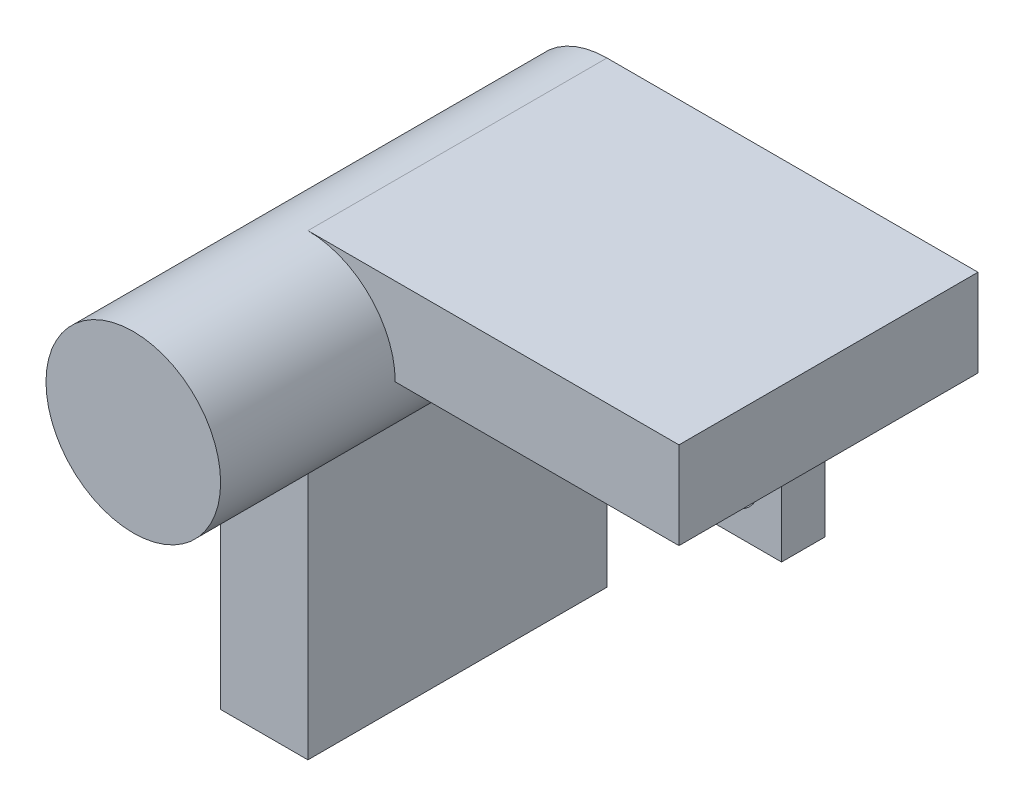
ISO-10303-21;
HEADER;
FILE_DESCRIPTION(('STEP AP214'),'2;1');
FILE_NAME('part.step','',(''),(''),'','','');
FILE_SCHEMA(('AUTOMOTIVE_DESIGN { 1 0 10303 214 1 1 1 1 }'));
ENDSEC;
DATA;
#1=APPLICATION_CONTEXT('core data for automotive mechanical design processes');
#2=APPLICATION_PROTOCOL_DEFINITION('international standard','automotive_design',2000,#1);
#3=PRODUCT_CONTEXT('',#1,'mechanical');
#4=PRODUCT('Part','Part','',(#3));
#5=PRODUCT_RELATED_PRODUCT_CATEGORY('part','',(#4));
#6=PRODUCT_DEFINITION_FORMATION('','',#4);
#7=PRODUCT_DEFINITION_CONTEXT('part definition',#1,'design');
#8=PRODUCT_DEFINITION('design','',#6,#7);
#9=PRODUCT_DEFINITION_SHAPE('','',#8);
#10=(LENGTH_UNIT() NAMED_UNIT(*) SI_UNIT(.MILLI.,.METRE.));
#11=(NAMED_UNIT(*) PLANE_ANGLE_UNIT() SI_UNIT($,.RADIAN.));
#12=(NAMED_UNIT(*) SI_UNIT($,.STERADIAN.) SOLID_ANGLE_UNIT());
#13=UNCERTAINTY_MEASURE_WITH_UNIT(LENGTH_MEASURE(1.E-05),#10,'distance_accuracy_value','');
#14=(GEOMETRIC_REPRESENTATION_CONTEXT(3) GLOBAL_UNCERTAINTY_ASSIGNED_CONTEXT((#13)) GLOBAL_UNIT_ASSIGNED_CONTEXT((#10,
#11,#12)) REPRESENTATION_CONTEXT('',''));
#15=CARTESIAN_POINT('',(0.,0.,0.));
#16=DIRECTION('',(0.,0.,1.));
#17=DIRECTION('',(1.,0.,0.));
#18=AXIS2_PLACEMENT_3D('',#15,#16,#17);
#19=CARTESIAN_POINT('',(0.,0.,0.));
#20=DIRECTION('',(0.,0.,1.));
#21=DIRECTION('',(1.,0.,0.));
#22=AXIS2_PLACEMENT_3D('',#19,#20,#21);
#23=PLANE('',#22);
#24=CARTESIAN_POINT('',(-46.,-4.,0.));
#25=DIRECTION('',(0.,0.,1.));
#26=DIRECTION('',(1.,0.,0.));
#27=AXIS2_PLACEMENT_3D('',#24,#25,#26);
#28=CIRCLE('',#27,4.00000000000001);
#29=CARTESIAN_POINT('',(-42.,-4.,0.));
#30=VERTEX_POINT('',#29);
#31=CARTESIAN_POINT('',(-46.,0.,0.));
#32=VERTEX_POINT('',#31);
#33=EDGE_CURVE('E50',#30,#32,#28,.T.);
#34=ORIENTED_EDGE('',*,*,#33,.F.);
#35=DIRECTION('',(-1.,0.,0.));
#36=VECTOR('',#35,1.);
#37=CARTESIAN_POINT('',(0.,-4.,0.));
#38=LINE('',#37,#36);
#39=CARTESIAN_POINT('',(-29.,-4.,0.));
#40=VERTEX_POINT('',#39);
#41=EDGE_CURVE('E141',#40,#30,#38,.T.);
#42=ORIENTED_EDGE('',*,*,#41,.F.);
#43=DIRECTION('',(0.,1.,0.));
#44=VECTOR('',#43,1.);
#45=CARTESIAN_POINT('',(-29.,0.,0.));
#46=LINE('',#45,#44);
#47=CARTESIAN_POINT('',(-29.,0.,0.));
#48=VERTEX_POINT('',#47);
#49=EDGE_CURVE('E137',#40,#48,#46,.T.);
#50=ORIENTED_EDGE('',*,*,#49,.T.);
#51=DIRECTION('',(-1.,0.,0.));
#52=VECTOR('',#51,1.);
#53=CARTESIAN_POINT('',(0.,0.,0.));
#54=LINE('',#53,#52);
#55=EDGE_CURVE('E188',#48,#32,#54,.T.);
#56=ORIENTED_EDGE('',*,*,#55,.T.);
#57=EDGE_LOOP('',(#34,#42,#50,#56));
#58=FACE_BOUND('',#57,.T.);
#59=ADVANCED_FACE('F39',(#58),#23,.T.);
#60=CARTESIAN_POINT('',(-50.,-4.,0.));
#61=VERTEX_POINT('',#60);
#62=CARTESIAN_POINT('',(-46.,-8.00000000000001,0.));
#63=VERTEX_POINT('',#62);
#64=EDGE_CURVE('E11',#61,#63,#28,.T.);
#65=ORIENTED_EDGE('',*,*,#64,.F.);
#66=DIRECTION('',(0.,1.,0.));
#67=VECTOR('',#66,1.);
#68=CARTESIAN_POINT('',(-50.,0.,0.));
#69=LINE('',#68,#67);
#70=CARTESIAN_POINT('',(-50.,-21.,0.));
#71=VERTEX_POINT('',#70);
#72=EDGE_CURVE('E194',#71,#61,#69,.T.);
#73=ORIENTED_EDGE('',*,*,#72,.F.);
#74=DIRECTION('',(-1.,0.,0.));
#75=VECTOR('',#74,1.);
#76=CARTESIAN_POINT('',(0.,-21.,0.));
#77=LINE('',#76,#75);
#78=CARTESIAN_POINT('',(-46.,-21.,0.));
#79=VERTEX_POINT('',#78);
#80=EDGE_CURVE('E189',#79,#71,#77,.T.);
#81=ORIENTED_EDGE('',*,*,#80,.F.);
#82=DIRECTION('',(0.,1.,0.));
#83=VECTOR('',#82,1.);
#84=CARTESIAN_POINT('',(-46.,0.,0.));
#85=LINE('',#84,#83);
#86=EDGE_CURVE('E183',#79,#63,#85,.T.);
#87=ORIENTED_EDGE('',*,*,#86,.T.);
#88=EDGE_LOOP('',(#65,#73,#81,#87));
#89=FACE_BOUND('',#88,.T.);
#90=ADVANCED_FACE('F222',(#89),#23,.T.);
#91=CARTESIAN_POINT('',(-46.,-4.,-41.398484809835));
#92=DIRECTION('',(0.,0.,1.));
#93=DIRECTION('',(1.,0.,0.));
#94=AXIS2_PLACEMENT_3D('',#91,#92,#93);
#95=CYLINDRICAL_SURFACE('',#94,4.00000000000001);
#96=DIRECTION('',(0.,0.,1.));
#97=VECTOR('',#96,1.);
#98=CARTESIAN_POINT('',(-46.,0.,-41.398484809835));
#99=LINE('',#98,#97);
#100=CARTESIAN_POINT('',(-46.,0.,-13.7));
#101=VERTEX_POINT('',#100);
#102=EDGE_CURVE('E43',#101,#32,#99,.T.);
#103=ORIENTED_EDGE('',*,*,#102,.F.);
#104=CARTESIAN_POINT('',(-46.,-4.,-13.7));
#105=DIRECTION('',(0.,0.,-1.));
#106=DIRECTION('',(0.,1.,0.));
#107=AXIS2_PLACEMENT_3D('',#104,#105,#106);
#108=CIRCLE('',#107,4.00000000000001);
#109=CARTESIAN_POINT('',(-50.,-4.,-13.7));
#110=VERTEX_POINT('',#109);
#111=EDGE_CURVE('E163',#110,#101,#108,.T.);
#112=ORIENTED_EDGE('',*,*,#111,.F.);
#113=DIRECTION('',(0.,0.,1.));
#114=VECTOR('',#113,1.);
#115=CARTESIAN_POINT('',(-50.,-4.,-41.398484809835));
#116=LINE('',#115,#114);
#117=EDGE_CURVE('E182',#110,#61,#116,.T.);
#118=ORIENTED_EDGE('',*,*,#117,.T.);
#119=ORIENTED_EDGE('',*,*,#64,.T.);
#120=DIRECTION('',(0.,0.,1.));
#121=VECTOR('',#120,1.);
#122=CARTESIAN_POINT('',(-46.,-8.00000000000001,-41.398484809835));
#123=LINE('',#122,#121);
#124=CARTESIAN_POINT('',(-46.,-8.00000000000001,-11.7));
#125=VERTEX_POINT('',#124);
#126=EDGE_CURVE('E203',#125,#63,#123,.T.);
#127=ORIENTED_EDGE('',*,*,#126,.F.);
#128=CARTESIAN_POINT('',(-46.,-4.,-11.7));
#129=DIRECTION('',(0.,0.,-1.));
#130=DIRECTION('',(0.,1.,0.));
#131=AXIS2_PLACEMENT_3D('',#128,#129,#130);
#132=CIRCLE('',#131,4.00000000000001);
#133=CARTESIAN_POINT('',(-42.,-4.,-11.7));
#134=VERTEX_POINT('',#133);
#135=EDGE_CURVE('E200',#125,#134,#132,.F.);
#136=ORIENTED_EDGE('',*,*,#135,.T.);
#137=DIRECTION('',(0.,0.,1.));
#138=VECTOR('',#137,1.);
#139=CARTESIAN_POINT('',(-42.,-4.,-41.398484809835));
#140=LINE('',#139,#138);
#141=EDGE_CURVE('E142',#134,#30,#140,.T.);
#142=ORIENTED_EDGE('',*,*,#141,.T.);
#143=ORIENTED_EDGE('',*,*,#33,.T.);
#144=EDGE_LOOP('',(#103,#112,#118,#119,#127,#136,#142,#143));
#145=FACE_BOUND('',#144,.T.);
#146=CARTESIAN_POINT('',(-46.,-4.,8.));
#147=DIRECTION('',(0.,0.,1.));
#148=DIRECTION('',(1.,0.,0.));
#149=AXIS2_PLACEMENT_3D('',#146,#147,#148);
#150=CIRCLE('',#149,4.00000000000001);
#151=CARTESIAN_POINT('',(-42.,-4.,8.));
#152=VERTEX_POINT('',#151);
#153=EDGE_CURVE('E176',#152,#152,#150,.T.);
#154=ORIENTED_EDGE('',*,*,#153,.F.);
#155=EDGE_LOOP('',(#154));
#156=FACE_BOUND('',#155,.T.);
#157=ADVANCED_FACE('F41',(#145,#156),#95,.T.);
#158=CARTESIAN_POINT('',(-50.,0.,-41.398484809835));
#159=DIRECTION('',(1.,0.,0.));
#160=DIRECTION('',(0.,0.,-1.));
#161=AXIS2_PLACEMENT_3D('',#158,#159,#160);
#162=PLANE('',#161);
#163=ORIENTED_EDGE('',*,*,#117,.F.);
#164=DIRECTION('',(0.,-1.,0.));
#165=VECTOR('',#164,1.);
#166=CARTESIAN_POINT('',(-50.,0.,-13.7));
#167=LINE('',#166,#165);
#168=CARTESIAN_POINT('',(-50.,-21.,-13.7));
#169=VERTEX_POINT('',#168);
#170=EDGE_CURVE('E160',#110,#169,#167,.T.);
#171=ORIENTED_EDGE('',*,*,#170,.T.);
#172=DIRECTION('',(0.,0.,1.));
#173=VECTOR('',#172,1.);
#174=CARTESIAN_POINT('',(-50.,-21.,-41.398484809835));
#175=LINE('',#174,#173);
#176=EDGE_CURVE('E197',#169,#71,#175,.T.);
#177=ORIENTED_EDGE('',*,*,#176,.T.);
#178=ORIENTED_EDGE('',*,*,#72,.T.);
#179=EDGE_LOOP('',(#163,#171,#177,#178));
#180=FACE_BOUND('',#179,.T.);
#181=ADVANCED_FACE('F218',(#180),#162,.F.);
#182=CARTESIAN_POINT('',(0.,-21.,-41.398484809835));
#183=DIRECTION('',(0.,1.,0.));
#184=DIRECTION('',(-1.,0.,0.));
#185=AXIS2_PLACEMENT_3D('',#182,#183,#184);
#186=PLANE('',#185);
#187=ORIENTED_EDGE('',*,*,#176,.F.);
#188=DIRECTION('',(1.,0.,0.));
#189=VECTOR('',#188,1.);
#190=CARTESIAN_POINT('',(0.,-21.,-13.7));
#191=LINE('',#190,#189);
#192=CARTESIAN_POINT('',(-46.,-21.,-13.7));
#193=VERTEX_POINT('',#192);
#194=EDGE_CURVE('E157',#169,#193,#191,.T.);
#195=ORIENTED_EDGE('',*,*,#194,.T.);
#196=DIRECTION('',(0.,0.,1.));
#197=VECTOR('',#196,1.);
#198=CARTESIAN_POINT('',(-46.,-21.,-41.398484809835));
#199=LINE('',#198,#197);
#200=EDGE_CURVE('E193',#193,#79,#199,.T.);
#201=ORIENTED_EDGE('',*,*,#200,.T.);
#202=ORIENTED_EDGE('',*,*,#80,.T.);
#203=EDGE_LOOP('',(#187,#195,#201,#202));
#204=FACE_BOUND('',#203,.T.);
#205=ADVANCED_FACE('F239',(#204),#186,.F.);
#206=CARTESIAN_POINT('',(-46.,0.,-41.398484809835));
#207=DIRECTION('',(1.,0.,0.));
#208=DIRECTION('',(0.,0.,-1.));
#209=AXIS2_PLACEMENT_3D('',#206,#207,#208);
#210=PLANE('',#209);
#211=ORIENTED_EDGE('',*,*,#200,.F.);
#212=DIRECTION('',(0.,-1.,0.));
#213=VECTOR('',#212,1.);
#214=CARTESIAN_POINT('',(-46.,0.,-13.7));
#215=LINE('',#214,#213);
#216=CARTESIAN_POINT('',(-46.,-14.,-13.7));
#217=VERTEX_POINT('',#216);
#218=EDGE_CURVE('E155',#217,#193,#215,.T.);
#219=ORIENTED_EDGE('',*,*,#218,.F.);
#220=DIRECTION('',(0.,0.,1.));
#221=VECTOR('',#220,1.);
#222=CARTESIAN_POINT('',(-46.,-14.,-13.7));
#223=LINE('',#222,#221);
#224=CARTESIAN_POINT('',(-46.,-14.,-11.7));
#225=VERTEX_POINT('',#224);
#226=EDGE_CURVE('E166',#217,#225,#223,.T.);
#227=ORIENTED_EDGE('',*,*,#226,.T.);
#228=DIRECTION('',(0.,1.,0.));
#229=VECTOR('',#228,1.);
#230=CARTESIAN_POINT('',(-46.,0.,-11.7));
#231=LINE('',#230,#229);
#232=EDGE_CURVE('E192',#225,#125,#231,.T.);
#233=ORIENTED_EDGE('',*,*,#232,.T.);
#234=ORIENTED_EDGE('',*,*,#126,.T.);
#235=ORIENTED_EDGE('',*,*,#86,.F.);
#236=EDGE_LOOP('',(#211,#219,#227,#233,#234,#235));
#237=FACE_BOUND('',#236,.T.);
#238=ADVANCED_FACE('F226',(#237),#210,.T.);
#239=CARTESIAN_POINT('',(0.,-4.,-41.398484809835));
#240=DIRECTION('',(0.,1.,0.));
#241=DIRECTION('',(0.,0.,1.));
#242=AXIS2_PLACEMENT_3D('',#239,#240,#241);
#243=PLANE('',#242);
#244=DIRECTION('',(-1.,0.,0.));
#245=VECTOR('',#244,1.);
#246=CARTESIAN_POINT('',(0.,-4.,-11.7));
#247=LINE('',#246,#245);
#248=CARTESIAN_POINT('',(-36.,-4.,-11.7));
#249=VERTEX_POINT('',#248);
#250=EDGE_CURVE('E178',#249,#134,#247,.T.);
#251=ORIENTED_EDGE('',*,*,#250,.F.);
#252=DIRECTION('',(0.,0.,1.));
#253=VECTOR('',#252,1.);
#254=CARTESIAN_POINT('',(-36.,-4.,-13.7));
#255=LINE('',#254,#253);
#256=CARTESIAN_POINT('',(-36.,-4.,-13.7));
#257=VERTEX_POINT('',#256);
#258=EDGE_CURVE('E147',#257,#249,#255,.T.);
#259=ORIENTED_EDGE('',*,*,#258,.F.);
#260=DIRECTION('',(1.,0.,0.));
#261=VECTOR('',#260,1.);
#262=CARTESIAN_POINT('',(0.,-4.,-13.7));
#263=LINE('',#262,#261);
#264=CARTESIAN_POINT('',(-29.,-4.,-13.7));
#265=VERTEX_POINT('',#264);
#266=EDGE_CURVE('E125',#257,#265,#263,.T.);
#267=ORIENTED_EDGE('',*,*,#266,.T.);
#268=DIRECTION('',(0.,0.,1.));
#269=VECTOR('',#268,1.);
#270=CARTESIAN_POINT('',(-29.,-4.,-41.398484809835));
#271=LINE('',#270,#269);
#272=EDGE_CURVE('E134',#265,#40,#271,.T.);
#273=ORIENTED_EDGE('',*,*,#272,.T.);
#274=ORIENTED_EDGE('',*,*,#41,.T.);
#275=ORIENTED_EDGE('',*,*,#141,.F.);
#276=EDGE_LOOP('',(#251,#259,#267,#273,#274,#275));
#277=FACE_BOUND('',#276,.T.);
#278=ADVANCED_FACE('F145',(#277),#243,.F.);
#279=CARTESIAN_POINT('',(-29.,0.,-41.398484809835));
#280=DIRECTION('',(1.,0.,0.));
#281=DIRECTION('',(0.,0.,-1.));
#282=AXIS2_PLACEMENT_3D('',#279,#280,#281);
#283=PLANE('',#282);
#284=ORIENTED_EDGE('',*,*,#272,.F.);
#285=DIRECTION('',(0.,-1.,0.));
#286=VECTOR('',#285,1.);
#287=CARTESIAN_POINT('',(-29.,0.,-13.7));
#288=LINE('',#287,#286);
#289=CARTESIAN_POINT('',(-29.,0.,-13.7));
#290=VERTEX_POINT('',#289);
#291=EDGE_CURVE('E119',#290,#265,#288,.T.);
#292=ORIENTED_EDGE('',*,*,#291,.F.);
#293=DIRECTION('',(0.,0.,1.));
#294=VECTOR('',#293,1.);
#295=CARTESIAN_POINT('',(-29.,0.,-41.398484809835));
#296=LINE('',#295,#294);
#297=EDGE_CURVE('E185',#290,#48,#296,.T.);
#298=ORIENTED_EDGE('',*,*,#297,.T.);
#299=ORIENTED_EDGE('',*,*,#49,.F.);
#300=EDGE_LOOP('',(#284,#292,#298,#299));
#301=FACE_BOUND('',#300,.T.);
#302=ADVANCED_FACE('F135',(#301),#283,.T.);
#303=CARTESIAN_POINT('',(0.,0.,-41.398484809835));
#304=DIRECTION('',(0.,1.,0.));
#305=DIRECTION('',(-1.,0.,0.));
#306=AXIS2_PLACEMENT_3D('',#303,#304,#305);
#307=PLANE('',#306);
#308=ORIENTED_EDGE('',*,*,#297,.F.);
#309=DIRECTION('',(1.,0.,0.));
#310=VECTOR('',#309,1.);
#311=CARTESIAN_POINT('',(0.,0.,-13.7));
#312=LINE('',#311,#310);
#313=EDGE_CURVE('E128',#101,#290,#312,.T.);
#314=ORIENTED_EDGE('',*,*,#313,.F.);
#315=ORIENTED_EDGE('',*,*,#102,.T.);
#316=ORIENTED_EDGE('',*,*,#55,.F.);
#317=EDGE_LOOP('',(#308,#314,#315,#316));
#318=FACE_BOUND('',#317,.T.);
#319=ADVANCED_FACE('F237',(#318),#307,.T.);
#320=CARTESIAN_POINT('',(0.,0.,8.));
#321=DIRECTION('',(0.,0.,1.));
#322=DIRECTION('',(1.,0.,0.));
#323=AXIS2_PLACEMENT_3D('',#320,#321,#322);
#324=PLANE('',#323);
#325=ORIENTED_EDGE('',*,*,#153,.T.);
#326=EDGE_LOOP('',(#325));
#327=FACE_BOUND('',#326,.T.);
#328=ADVANCED_FACE('F254',(#327),#324,.T.);
#329=CARTESIAN_POINT('',(-46.,-4.,-11.7));
#330=DIRECTION('',(0.,0.,-1.));
#331=DIRECTION('',(0.,1.,0.));
#332=AXIS2_PLACEMENT_3D('',#329,#330,#331);
#333=PLANE('',#332);
#334=CARTESIAN_POINT('',(-38.5251262658471,-11.4748737341529,-11.7));
#335=DIRECTION('',(0.,0.,-1.));
#336=DIRECTION('',(0.,1.,0.));
#337=AXIS2_PLACEMENT_3D('',#334,#335,#336);
#338=CIRCLE('',#337,1.5);
#339=CARTESIAN_POINT('',(-37.0251262658471,-11.4748737341529,-11.7));
#340=VERTEX_POINT('',#339);
#341=EDGE_CURVE('E449',#340,#340,#338,.T.);
#342=ORIENTED_EDGE('',*,*,#341,.T.);
#343=EDGE_LOOP('',(#342));
#344=FACE_BOUND('',#343,.T.);
#345=DIRECTION('',(0.,1.,0.));
#346=VECTOR('',#345,1.);
#347=CARTESIAN_POINT('',(-36.,0.,-11.7));
#348=LINE('',#347,#346);
#349=CARTESIAN_POINT('',(-36.,-14.,-11.7));
#350=VERTEX_POINT('',#349);
#351=EDGE_CURVE('E167',#350,#249,#348,.T.);
#352=ORIENTED_EDGE('',*,*,#351,.T.);
#353=ORIENTED_EDGE('',*,*,#250,.T.);
#354=ORIENTED_EDGE('',*,*,#135,.F.);
#355=ORIENTED_EDGE('',*,*,#232,.F.);
#356=DIRECTION('',(-1.,0.,0.));
#357=VECTOR('',#356,1.);
#358=CARTESIAN_POINT('',(0.,-14.,-11.7));
#359=LINE('',#358,#357);
#360=EDGE_CURVE('E131',#350,#225,#359,.T.);
#361=ORIENTED_EDGE('',*,*,#360,.F.);
#362=EDGE_LOOP('',(#352,#353,#354,#355,#361));
#363=FACE_BOUND('',#362,.T.);
#364=ADVANCED_FACE('F232',(#344,#363),#333,.F.);
#365=CARTESIAN_POINT('',(-46.,-4.,-13.7));
#366=DIRECTION('',(0.,0.,-1.));
#367=DIRECTION('',(0.,1.,0.));
#368=AXIS2_PLACEMENT_3D('',#365,#366,#367);
#369=PLANE('',#368);
#370=ORIENTED_EDGE('',*,*,#291,.T.);
#371=ORIENTED_EDGE('',*,*,#266,.F.);
#372=DIRECTION('',(0.,1.,0.));
#373=VECTOR('',#372,1.);
#374=CARTESIAN_POINT('',(-36.,0.,-13.7));
#375=LINE('',#374,#373);
#376=CARTESIAN_POINT('',(-36.,-14.,-13.7));
#377=VERTEX_POINT('',#376);
#378=EDGE_CURVE('E148',#377,#257,#375,.T.);
#379=ORIENTED_EDGE('',*,*,#378,.F.);
#380=DIRECTION('',(-1.,0.,0.));
#381=VECTOR('',#380,1.);
#382=CARTESIAN_POINT('',(0.,-14.,-13.7));
#383=LINE('',#382,#381);
#384=EDGE_CURVE('E150',#377,#217,#383,.T.);
#385=ORIENTED_EDGE('',*,*,#384,.T.);
#386=ORIENTED_EDGE('',*,*,#218,.T.);
#387=ORIENTED_EDGE('',*,*,#194,.F.);
#388=ORIENTED_EDGE('',*,*,#170,.F.);
#389=ORIENTED_EDGE('',*,*,#111,.T.);
#390=ORIENTED_EDGE('',*,*,#313,.T.);
#391=EDGE_LOOP('',(#370,#371,#379,#385,#386,#387,#388,#389,#390));
#392=FACE_BOUND('',#391,.T.);
#393=CARTESIAN_POINT('',(-38.5251262658471,-11.4748737341529,-13.7));
#394=DIRECTION('',(0.,0.,-1.));
#395=DIRECTION('',(0.,1.,0.));
#396=AXIS2_PLACEMENT_3D('',#393,#394,#395);
#397=CIRCLE('',#396,1.5);
#398=CARTESIAN_POINT('',(-37.0251262658471,-11.4748737341529,-13.7));
#399=VERTEX_POINT('',#398);
#400=EDGE_CURVE('E169',#399,#399,#397,.T.);
#401=ORIENTED_EDGE('',*,*,#400,.F.);
#402=EDGE_LOOP('',(#401));
#403=FACE_BOUND('',#402,.T.);
#404=ADVANCED_FACE('F121',(#392,#403),#369,.T.);
#405=CARTESIAN_POINT('',(-36.,0.,-13.7));
#406=DIRECTION('',(1.,0.,0.));
#407=DIRECTION('',(0.,0.,-1.));
#408=AXIS2_PLACEMENT_3D('',#405,#406,#407);
#409=PLANE('',#408);
#410=ORIENTED_EDGE('',*,*,#351,.F.);
#411=DIRECTION('',(0.,0.,1.));
#412=VECTOR('',#411,1.);
#413=CARTESIAN_POINT('',(-36.,-14.,-13.7));
#414=LINE('',#413,#412);
#415=EDGE_CURVE('E173',#377,#350,#414,.T.);
#416=ORIENTED_EDGE('',*,*,#415,.F.);
#417=ORIENTED_EDGE('',*,*,#378,.T.);
#418=ORIENTED_EDGE('',*,*,#258,.T.);
#419=EDGE_LOOP('',(#410,#416,#417,#418));
#420=FACE_BOUND('',#419,.T.);
#421=ADVANCED_FACE('F292',(#420),#409,.T.);
#422=CARTESIAN_POINT('',(0.,-14.,-13.7));
#423=DIRECTION('',(0.,1.,0.));
#424=DIRECTION('',(-1.,0.,0.));
#425=AXIS2_PLACEMENT_3D('',#422,#423,#424);
#426=PLANE('',#425);
#427=ORIENTED_EDGE('',*,*,#360,.T.);
#428=ORIENTED_EDGE('',*,*,#226,.F.);
#429=ORIENTED_EDGE('',*,*,#384,.F.);
#430=ORIENTED_EDGE('',*,*,#415,.T.);
#431=EDGE_LOOP('',(#427,#428,#429,#430));
#432=FACE_BOUND('',#431,.T.);
#433=ADVANCED_FACE('F299',(#432),#426,.F.);
#434=CARTESIAN_POINT('',(-38.5251262658471,-11.4748737341529,-13.7));
#435=DIRECTION('',(0.,0.,1.));
#436=DIRECTION('',(1.,0.,0.));
#437=AXIS2_PLACEMENT_3D('',#434,#435,#436);
#438=CYLINDRICAL_SURFACE('',#437,1.5);
#439=CARTESIAN_POINT('',(-37.0251262658471,-11.4748737341529,-13.7));
#440=CARTESIAN_POINT('',(-37.0251262658471,-11.4748737341529,-13.6791666666667));
#441=CARTESIAN_POINT('',(-37.0251262658471,-11.4748737341529,-13.6583333333333));
#442=CARTESIAN_POINT('',(-37.0251262658471,-11.4748737341529,-13.6166666666667));
#443=CARTESIAN_POINT('',(-37.0251262658471,-11.4748737341529,-13.5958333333333));
#444=CARTESIAN_POINT('',(-37.0251262658471,-11.4748737341529,-13.5541666666667));
#445=CARTESIAN_POINT('',(-37.0251262658471,-11.4748737341529,-13.5333333333333));
#446=CARTESIAN_POINT('',(-37.0251262658471,-11.4748737341529,-13.4916666666667));
#447=CARTESIAN_POINT('',(-37.0251262658471,-11.4748737341529,-13.4708333333333));
#448=CARTESIAN_POINT('',(-37.0251262658471,-11.4748737341529,-13.4291666666667));
#449=CARTESIAN_POINT('',(-37.0251262658471,-11.4748737341529,-13.4083333333333));
#450=CARTESIAN_POINT('',(-37.0251262658471,-11.4748737341529,-13.3666666666667));
#451=CARTESIAN_POINT('',(-37.0251262658471,-11.4748737341529,-13.3458333333333));
#452=CARTESIAN_POINT('',(-37.0251262658471,-11.4748737341529,-13.3041666666667));
#453=CARTESIAN_POINT('',(-37.0251262658471,-11.4748737341529,-13.2833333333333));
#454=CARTESIAN_POINT('',(-37.0251262658471,-11.4748737341529,-13.2416666666667));
#455=CARTESIAN_POINT('',(-37.0251262658471,-11.4748737341529,-13.2208333333333));
#456=CARTESIAN_POINT('',(-37.0251262658471,-11.4748737341529,-13.1791666666667));
#457=CARTESIAN_POINT('',(-37.0251262658471,-11.4748737341529,-13.1583333333333));
#458=CARTESIAN_POINT('',(-37.0251262658471,-11.4748737341529,-13.1166666666667));
#459=CARTESIAN_POINT('',(-37.0251262658471,-11.4748737341529,-13.0958333333333));
#460=CARTESIAN_POINT('',(-37.0251262658471,-11.4748737341529,-13.0541666666667));
#461=CARTESIAN_POINT('',(-37.0251262658471,-11.4748737341529,-13.0333333333333));
#462=CARTESIAN_POINT('',(-37.0251262658471,-11.4748737341529,-12.9916666666667));
#463=CARTESIAN_POINT('',(-37.0251262658471,-11.4748737341529,-12.9708333333333));
#464=CARTESIAN_POINT('',(-37.0251262658471,-11.4748737341529,-12.9291666666667));
#465=CARTESIAN_POINT('',(-37.0251262658471,-11.4748737341529,-12.9083333333333));
#466=CARTESIAN_POINT('',(-37.0251262658471,-11.4748737341529,-12.8666666666667));
#467=CARTESIAN_POINT('',(-37.0251262658471,-11.4748737341529,-12.8458333333333));
#468=CARTESIAN_POINT('',(-37.0251262658471,-11.4748737341529,-12.8041666666667));
#469=CARTESIAN_POINT('',(-37.0251262658471,-11.4748737341529,-12.7833333333333));
#470=CARTESIAN_POINT('',(-37.0251262658471,-11.4748737341529,-12.7416666666667));
#471=CARTESIAN_POINT('',(-37.0251262658471,-11.4748737341529,-12.7208333333333));
#472=CARTESIAN_POINT('',(-37.0251262658471,-11.4748737341529,-12.6791666666667));
#473=CARTESIAN_POINT('',(-37.0251262658471,-11.4748737341529,-12.6583333333333));
#474=CARTESIAN_POINT('',(-37.0251262658471,-11.4748737341529,-12.6166666666667));
#475=CARTESIAN_POINT('',(-37.0251262658471,-11.4748737341529,-12.5958333333333));
#476=CARTESIAN_POINT('',(-37.0251262658471,-11.4748737341529,-12.5541666666667));
#477=CARTESIAN_POINT('',(-37.0251262658471,-11.4748737341529,-12.5333333333333));
#478=CARTESIAN_POINT('',(-37.0251262658471,-11.4748737341529,-12.4916666666667));
#479=CARTESIAN_POINT('',(-37.0251262658471,-11.4748737341529,-12.4708333333333));
#480=CARTESIAN_POINT('',(-37.0251262658471,-11.4748737341529,-12.4291666666667));
#481=CARTESIAN_POINT('',(-37.0251262658471,-11.4748737341529,-12.4083333333333));
#482=CARTESIAN_POINT('',(-37.0251262658471,-11.4748737341529,-12.3666666666667));
#483=CARTESIAN_POINT('',(-37.0251262658471,-11.4748737341529,-12.3458333333333));
#484=CARTESIAN_POINT('',(-37.0251262658471,-11.4748737341529,-12.3041666666667));
#485=CARTESIAN_POINT('',(-37.0251262658471,-11.4748737341529,-12.2833333333333));
#486=CARTESIAN_POINT('',(-37.0251262658471,-11.4748737341529,-12.2416666666667));
#487=CARTESIAN_POINT('',(-37.0251262658471,-11.4748737341529,-12.2208333333333));
#488=CARTESIAN_POINT('',(-37.0251262658471,-11.4748737341529,-12.1791666666667));
#489=CARTESIAN_POINT('',(-37.0251262658471,-11.4748737341529,-12.1583333333333));
#490=CARTESIAN_POINT('',(-37.0251262658471,-11.4748737341529,-12.1166666666667));
#491=CARTESIAN_POINT('',(-37.0251262658471,-11.4748737341529,-12.0958333333333));
#492=CARTESIAN_POINT('',(-37.0251262658471,-11.4748737341529,-12.0541666666667));
#493=CARTESIAN_POINT('',(-37.0251262658471,-11.4748737341529,-12.0333333333333));
#494=CARTESIAN_POINT('',(-37.0251262658471,-11.4748737341529,-11.9916666666667));
#495=CARTESIAN_POINT('',(-37.0251262658471,-11.4748737341529,-11.9708333333333));
#496=CARTESIAN_POINT('',(-37.0251262658471,-11.4748737341529,-11.9291666666667));
#497=CARTESIAN_POINT('',(-37.0251262658471,-11.4748737341529,-11.9083333333333));
#498=CARTESIAN_POINT('',(-37.0251262658471,-11.4748737341529,-11.8666666666667));
#499=CARTESIAN_POINT('',(-37.0251262658471,-11.4748737341529,-11.8458333333333));
#500=CARTESIAN_POINT('',(-37.0251262658471,-11.4748737341529,-11.8041666666667));
#501=CARTESIAN_POINT('',(-37.0251262658471,-11.4748737341529,-11.7833333333333));
#502=CARTESIAN_POINT('',(-37.0251262658471,-11.4748737341529,-11.7416666666667));
#503=CARTESIAN_POINT('',(-37.0251262658471,-11.4748737341529,-11.7208333333333));
#504=CARTESIAN_POINT('',(-37.0251262658471,-11.4748737341529,-11.7));
#505=B_SPLINE_CURVE_WITH_KNOTS('',3,(#439,#440,#441,#442,#443,#444,#445,#446,#447,#448,#449,
#450,#451,#452,#453,#454,#455,#456,#457,#458,#459,#460,#461,#462,#463,#464,#465,#466,#467,#468,
#469,#470,#471,#472,#473,#474,#475,#476,#477,#478,#479,#480,#481,#482,#483,#484,#485,#486,#487,
#488,#489,#490,#491,#492,#493,#494,#495,#496,#497,#498,#499,#500,#501,#502,#503,#504),
.UNSPECIFIED.,.F.,.F.,(4,2,2,2,2,2,2,2,2,2,2,2,2,2,2,2,2,2,2,2,2,2,2,2,2,2,2,2,2,2,2,2,4),(0.,
0.0625000000000001,0.125,0.1875,0.25,0.3125,0.375,0.4375,0.5,0.5625,0.625000000000001,
0.687500000000001,0.750000000000001,0.812500000000001,0.875000000000001,0.937500000000001,1.,
1.0625,1.125,1.1875,1.25,1.3125,1.375,1.4375,1.5,1.5625,1.625,1.6875,1.75,1.8125,1.875,1.9375,
2.),.UNSPECIFIED.);
#506=EDGE_CURVE('BSEAM306',#399,#340,#505,.T.);
#507=ORIENTED_EDGE('',*,*,#400,.T.);
#508=ORIENTED_EDGE('',*,*,#341,.F.);
#509=ORIENTED_EDGE('',*,*,#506,.T.);
#510=ORIENTED_EDGE('',*,*,#506,.F.);
#511=EDGE_LOOP('',(#507,#509,#508,#510));
#512=FACE_BOUND('',#511,.T.);
#513=ADVANCED_FACE('F306',(#512),#438,.F.);
#514=CLOSED_SHELL('',(#59,#90,#157,#181,#205,#238,#278,#302,#319,#328,#364,#404,#421,#433,#513));
#515=MANIFOLD_SOLID_BREP('B2',#514);
#516=ADVANCED_BREP_SHAPE_REPRESENTATION('',(#18,#515),#14);
#517=SHAPE_DEFINITION_REPRESENTATION(#9,#516);
ENDSEC;
END-ISO-10303-21;
